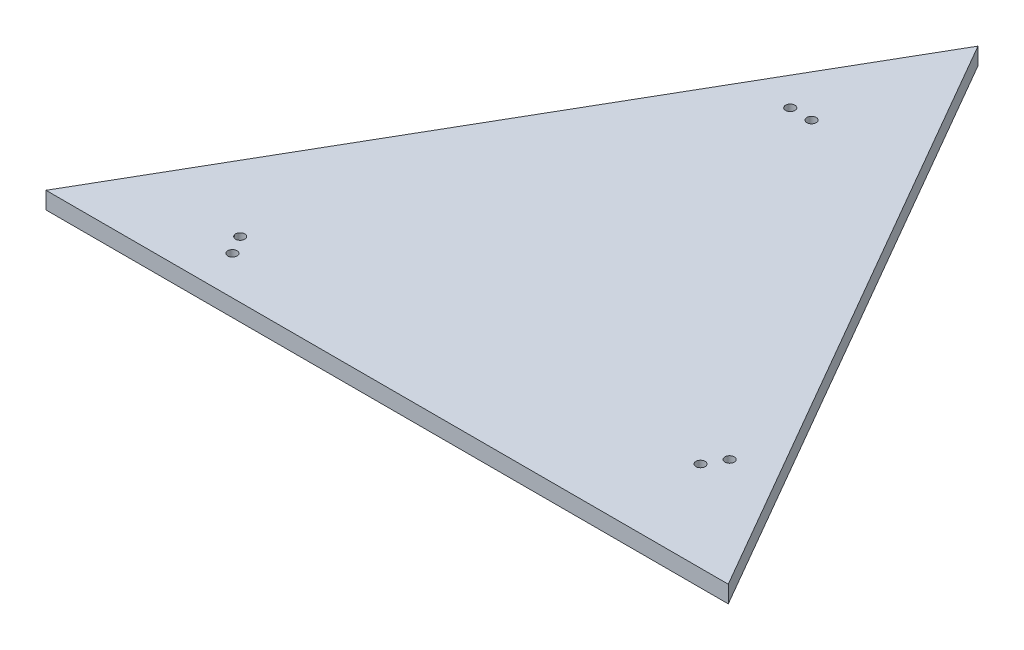
ISO-10303-21;
HEADER;
FILE_DESCRIPTION(('STEP AP214'),'2;1');
FILE_NAME('part.step','',(''),(''),'','','');
FILE_SCHEMA(('AUTOMOTIVE_DESIGN { 1 0 10303 214 1 1 1 1 }'));
ENDSEC;
DATA;
#1=APPLICATION_CONTEXT('core data for automotive mechanical design processes');
#2=APPLICATION_PROTOCOL_DEFINITION('international standard','automotive_design',2000,#1);
#3=PRODUCT_CONTEXT('',#1,'mechanical');
#4=PRODUCT('Part','Part','',(#3));
#5=PRODUCT_RELATED_PRODUCT_CATEGORY('part','',(#4));
#6=PRODUCT_DEFINITION_FORMATION('','',#4);
#7=PRODUCT_DEFINITION_CONTEXT('part definition',#1,'design');
#8=PRODUCT_DEFINITION('design','',#6,#7);
#9=PRODUCT_DEFINITION_SHAPE('','',#8);
#10=(LENGTH_UNIT() NAMED_UNIT(*) SI_UNIT(.MILLI.,.METRE.));
#11=(NAMED_UNIT(*) PLANE_ANGLE_UNIT() SI_UNIT($,.RADIAN.));
#12=(NAMED_UNIT(*) SI_UNIT($,.STERADIAN.) SOLID_ANGLE_UNIT());
#13=UNCERTAINTY_MEASURE_WITH_UNIT(LENGTH_MEASURE(1.E-05),#10,'distance_accuracy_value','');
#14=(GEOMETRIC_REPRESENTATION_CONTEXT(3) GLOBAL_UNCERTAINTY_ASSIGNED_CONTEXT((#13)) GLOBAL_UNIT_ASSIGNED_CONTEXT((#10,
#11,#12)) REPRESENTATION_CONTEXT('',''));
#15=CARTESIAN_POINT('',(0.,0.,0.));
#16=DIRECTION('',(0.,0.,1.));
#17=DIRECTION('',(1.,0.,0.));
#18=AXIS2_PLACEMENT_3D('',#15,#16,#17);
#19=CARTESIAN_POINT('',(127.,6.35,73.3234841870812));
#20=DIRECTION('',(-0.866025403784437,0.,0.500000000000002));
#21=DIRECTION('',(0.500000000000002,0.,0.866025403784437));
#22=AXIS2_PLACEMENT_3D('',#19,#20,#21);
#23=PLANE('',#22);
#24=DIRECTION('',(-0.500000000000002,0.,-0.866025403784437));
#25=VECTOR('',#24,1.);
#26=CARTESIAN_POINT('',(127.,0.,73.3234841870812));
#27=LINE('',#26,#25);
#28=CARTESIAN_POINT('',(127.,0.,73.3234841870812));
#29=VERTEX_POINT('',#28);
#30=CARTESIAN_POINT('',(0.,0.,-146.646968374165));
#31=VERTEX_POINT('',#30);
#32=EDGE_CURVE('E79',#29,#31,#27,.T.);
#33=ORIENTED_EDGE('',*,*,#32,.T.);
#34=DIRECTION('',(0.,-1.,0.));
#35=VECTOR('',#34,1.);
#36=CARTESIAN_POINT('',(0.,6.35,-146.646968374165));
#37=LINE('',#36,#35);
#38=CARTESIAN_POINT('',(0.,6.35,-146.646968374165));
#39=VERTEX_POINT('',#38);
#40=EDGE_CURVE('E11',#39,#31,#37,.T.);
#41=ORIENTED_EDGE('',*,*,#40,.F.);
#42=DIRECTION('',(-0.500000000000002,0.,-0.866025403784437));
#43=VECTOR('',#42,1.);
#44=CARTESIAN_POINT('',(127.,6.35,73.3234841870812));
#45=LINE('',#44,#43);
#46=CARTESIAN_POINT('',(127.,6.35,73.3234841870812));
#47=VERTEX_POINT('',#46);
#48=EDGE_CURVE('E72',#47,#39,#45,.T.);
#49=ORIENTED_EDGE('',*,*,#48,.F.);
#50=DIRECTION('',(0.,-1.,0.));
#51=VECTOR('',#50,1.);
#52=CARTESIAN_POINT('',(127.,6.35,73.3234841870812));
#53=LINE('',#52,#51);
#54=EDGE_CURVE('E80',#47,#29,#53,.T.);
#55=ORIENTED_EDGE('',*,*,#54,.T.);
#56=EDGE_LOOP('',(#33,#41,#49,#55));
#57=FACE_BOUND('',#56,.T.);
#58=ADVANCED_FACE('F32',(#57),#23,.F.);
#59=CARTESIAN_POINT('',(0.,6.35,-146.646968374165));
#60=DIRECTION('',(0.86602540378444,0.,0.499999999999998));
#61=DIRECTION('',(0.499999999999998,0.,-0.86602540378444));
#62=AXIS2_PLACEMENT_3D('',#59,#60,#61);
#63=PLANE('',#62);
#64=DIRECTION('',(-0.499999999999998,0.,0.86602540378444));
#65=VECTOR('',#64,1.);
#66=CARTESIAN_POINT('',(0.,0.,-146.646968374165));
#67=LINE('',#66,#65);
#68=CARTESIAN_POINT('',(-126.999999999999,0.,73.323484187083));
#69=VERTEX_POINT('',#68);
#70=EDGE_CURVE('E60',#31,#69,#67,.T.);
#71=ORIENTED_EDGE('',*,*,#70,.T.);
#72=DIRECTION('',(0.,-1.,0.));
#73=VECTOR('',#72,1.);
#74=CARTESIAN_POINT('',(-126.999999999999,6.35,73.323484187083));
#75=LINE('',#74,#73);
#76=CARTESIAN_POINT('',(-126.999999999999,6.35,73.323484187083));
#77=VERTEX_POINT('',#76);
#78=EDGE_CURVE('E40',#77,#69,#75,.T.);
#79=ORIENTED_EDGE('',*,*,#78,.F.);
#80=DIRECTION('',(-0.499999999999998,0.,0.86602540378444));
#81=VECTOR('',#80,1.);
#82=CARTESIAN_POINT('',(0.,6.35,-146.646968374165));
#83=LINE('',#82,#81);
#84=EDGE_CURVE('E68',#39,#77,#83,.T.);
#85=ORIENTED_EDGE('',*,*,#84,.F.);
#86=ORIENTED_EDGE('',*,*,#40,.T.);
#87=EDGE_LOOP('',(#71,#79,#85,#86));
#88=FACE_BOUND('',#87,.T.);
#89=ADVANCED_FACE('F69',(#88),#63,.F.);
#90=CARTESIAN_POINT('',(-126.999999999999,6.35,73.323484187083));
#91=DIRECTION('',(0.,0.,-1.));
#92=DIRECTION('',(-1.,0.,0.));
#93=AXIS2_PLACEMENT_3D('',#90,#91,#92);
#94=PLANE('',#93);
#95=DIRECTION('',(1.,0.,0.));
#96=VECTOR('',#95,1.);
#97=CARTESIAN_POINT('',(-126.999999999999,0.,73.323484187083));
#98=LINE('',#97,#96);
#99=EDGE_CURVE('E65',#69,#29,#98,.T.);
#100=ORIENTED_EDGE('',*,*,#99,.T.);
#101=ORIENTED_EDGE('',*,*,#54,.F.);
#102=DIRECTION('',(1.,0.,0.));
#103=VECTOR('',#102,1.);
#104=CARTESIAN_POINT('',(-126.999999999999,6.35,73.323484187083));
#105=LINE('',#104,#103);
#106=EDGE_CURVE('E48',#77,#47,#105,.T.);
#107=ORIENTED_EDGE('',*,*,#106,.F.);
#108=ORIENTED_EDGE('',*,*,#78,.T.);
#109=EDGE_LOOP('',(#100,#101,#107,#108));
#110=FACE_BOUND('',#109,.T.);
#111=ADVANCED_FACE('F91',(#110),#94,.F.);
#112=CARTESIAN_POINT('',(0.,6.35,0.));
#113=DIRECTION('',(0.,1.,0.));
#114=DIRECTION('',(0.,0.,1.));
#115=AXIS2_PLACEMENT_3D('',#112,#113,#114);
#116=PLANE('',#115);
#117=CARTESIAN_POINT('',(87.0425218066059,6.35,32.8616929468107));
#118=DIRECTION('',(0.,1.,0.));
#119=DIRECTION('',(0.,0.,1.));
#120=AXIS2_PLACEMENT_3D('',#117,#118,#119);
#121=CIRCLE('',#120,1.72720000000002);
#122=CARTESIAN_POINT('',(87.0425218066059,6.35,34.5888929468107));
#123=VERTEX_POINT('',#122);
#124=EDGE_CURVE('E190',#123,#123,#121,.T.);
#125=ORIENTED_EDGE('',*,*,#124,.F.);
#126=EDGE_LOOP('',(#125));
#127=FACE_BOUND('',#126,.T.);
#128=CARTESIAN_POINT('',(-7.1374,6.35,-91.8118815673871));
#129=DIRECTION('',(0.,1.,0.));
#130=DIRECTION('',(0.,0.,1.));
#131=AXIS2_PLACEMENT_3D('',#128,#129,#130);
#132=CIRCLE('',#131,1.7272);
#133=CARTESIAN_POINT('',(-7.1374,6.35,-90.0846815673871));
#134=VERTEX_POINT('',#133);
#135=EDGE_CURVE('E194',#134,#134,#132,.T.);
#136=ORIENTED_EDGE('',*,*,#135,.F.);
#137=EDGE_LOOP('',(#136));
#138=FACE_BOUND('',#137,.T.);
#139=CARTESIAN_POINT('',(-15.0622,6.35,-91.8118815673871));
#140=DIRECTION('',(0.,1.,0.));
#141=DIRECTION('',(0.,0.,1.));
#142=AXIS2_PLACEMENT_3D('',#139,#140,#141);
#143=CIRCLE('',#142,1.7272);
#144=CARTESIAN_POINT('',(-15.0622,6.35,-90.0846815673871));
#145=VERTEX_POINT('',#144);
#146=EDGE_CURVE('E201',#145,#145,#143,.T.);
#147=ORIENTED_EDGE('',*,*,#146,.F.);
#148=EDGE_LOOP('',(#147));
#149=FACE_BOUND('',#148,.T.);
#150=CARTESIAN_POINT('',(83.0801218066059,6.35,39.7247710667216));
#151=DIRECTION('',(0.,1.,0.));
#152=DIRECTION('',(0.,0.,1.));
#153=AXIS2_PLACEMENT_3D('',#150,#151,#152);
#154=CIRCLE('',#153,1.72720000000002);
#155=CARTESIAN_POINT('',(83.0801218066059,6.35,41.4519710667216));
#156=VERTEX_POINT('',#155);
#157=EDGE_CURVE('E207',#156,#156,#154,.T.);
#158=ORIENTED_EDGE('',*,*,#157,.F.);
#159=EDGE_LOOP('',(#158));
#160=FACE_BOUND('',#159,.T.);
#161=CARTESIAN_POINT('',(-71.9803218066055,6.35,58.9501886205757));
#162=DIRECTION('',(0.,1.,0.));
#163=DIRECTION('',(0.,0.,1.));
#164=AXIS2_PLACEMENT_3D('',#161,#162,#163);
#165=CIRCLE('',#164,1.72720000000002);
#166=CARTESIAN_POINT('',(-71.9803218066055,6.35,60.6773886205757));
#167=VERTEX_POINT('',#166);
#168=EDGE_CURVE('E213',#167,#167,#165,.T.);
#169=ORIENTED_EDGE('',*,*,#168,.F.);
#170=EDGE_LOOP('',(#169));
#171=FACE_BOUND('',#170,.T.);
#172=CARTESIAN_POINT('',(-75.9427218066056,6.35,52.0871105006648));
#173=DIRECTION('',(0.,1.,0.));
#174=DIRECTION('',(0.,0.,1.));
#175=AXIS2_PLACEMENT_3D('',#172,#173,#174);
#176=CIRCLE('',#175,1.72720000000001);
#177=CARTESIAN_POINT('',(-75.9427218066056,6.35,53.8143105006648));
#178=VERTEX_POINT('',#177);
#179=EDGE_CURVE('E86',#178,#178,#176,.T.);
#180=ORIENTED_EDGE('',*,*,#179,.F.);
#181=EDGE_LOOP('',(#180));
#182=FACE_BOUND('',#181,.T.);
#183=ORIENTED_EDGE('',*,*,#48,.T.);
#184=ORIENTED_EDGE('',*,*,#84,.T.);
#185=ORIENTED_EDGE('',*,*,#106,.T.);
#186=EDGE_LOOP('',(#183,#184,#185));
#187=FACE_BOUND('',#186,.T.);
#188=ADVANCED_FACE('F75',(#127,#138,#149,#160,#171,#182,#187),#116,.T.);
#189=CARTESIAN_POINT('',(0.,0.,0.));
#190=DIRECTION('',(0.,1.,0.));
#191=DIRECTION('',(0.,0.,1.));
#192=AXIS2_PLACEMENT_3D('',#189,#190,#191);
#193=PLANE('',#192);
#194=CARTESIAN_POINT('',(87.0425218066059,0.,32.8616929468107));
#195=DIRECTION('',(0.,1.,0.));
#196=DIRECTION('',(0.,0.,1.));
#197=AXIS2_PLACEMENT_3D('',#194,#195,#196);
#198=CIRCLE('',#197,1.72720000000002);
#199=CARTESIAN_POINT('',(87.0425218066059,0.,34.5888929468107));
#200=VERTEX_POINT('',#199);
#201=EDGE_CURVE('E187',#200,#200,#198,.T.);
#202=ORIENTED_EDGE('',*,*,#201,.T.);
#203=EDGE_LOOP('',(#202));
#204=FACE_BOUND('',#203,.T.);
#205=CARTESIAN_POINT('',(-7.1374,0.,-91.8118815673871));
#206=DIRECTION('',(0.,1.,0.));
#207=DIRECTION('',(0.,0.,1.));
#208=AXIS2_PLACEMENT_3D('',#205,#206,#207);
#209=CIRCLE('',#208,1.7272);
#210=CARTESIAN_POINT('',(-7.1374,0.,-90.0846815673871));
#211=VERTEX_POINT('',#210);
#212=EDGE_CURVE('E191',#211,#211,#209,.T.);
#213=ORIENTED_EDGE('',*,*,#212,.T.);
#214=EDGE_LOOP('',(#213));
#215=FACE_BOUND('',#214,.T.);
#216=CARTESIAN_POINT('',(-15.0622,0.,-91.8118815673871));
#217=DIRECTION('',(0.,1.,0.));
#218=DIRECTION('',(0.,0.,1.));
#219=AXIS2_PLACEMENT_3D('',#216,#217,#218);
#220=CIRCLE('',#219,1.7272);
#221=CARTESIAN_POINT('',(-15.0622,0.,-90.0846815673871));
#222=VERTEX_POINT('',#221);
#223=EDGE_CURVE('E199',#222,#222,#220,.T.);
#224=ORIENTED_EDGE('',*,*,#223,.T.);
#225=EDGE_LOOP('',(#224));
#226=FACE_BOUND('',#225,.T.);
#227=CARTESIAN_POINT('',(83.0801218066059,0.,39.7247710667216));
#228=DIRECTION('',(0.,1.,0.));
#229=DIRECTION('',(0.,0.,1.));
#230=AXIS2_PLACEMENT_3D('',#227,#228,#229);
#231=CIRCLE('',#230,1.72720000000002);
#232=CARTESIAN_POINT('',(83.0801218066059,0.,41.4519710667216));
#233=VERTEX_POINT('',#232);
#234=EDGE_CURVE('E204',#233,#233,#231,.T.);
#235=ORIENTED_EDGE('',*,*,#234,.T.);
#236=EDGE_LOOP('',(#235));
#237=FACE_BOUND('',#236,.T.);
#238=CARTESIAN_POINT('',(-71.9803218066055,0.,58.9501886205757));
#239=DIRECTION('',(0.,1.,0.));
#240=DIRECTION('',(0.,0.,1.));
#241=AXIS2_PLACEMENT_3D('',#238,#239,#240);
#242=CIRCLE('',#241,1.72720000000002);
#243=CARTESIAN_POINT('',(-71.9803218066055,0.,60.6773886205757));
#244=VERTEX_POINT('',#243);
#245=EDGE_CURVE('E210',#244,#244,#242,.T.);
#246=ORIENTED_EDGE('',*,*,#245,.T.);
#247=EDGE_LOOP('',(#246));
#248=FACE_BOUND('',#247,.T.);
#249=CARTESIAN_POINT('',(-75.9427218066056,0.,52.0871105006648));
#250=DIRECTION('',(0.,1.,0.));
#251=DIRECTION('',(0.,0.,1.));
#252=AXIS2_PLACEMENT_3D('',#249,#250,#251);
#253=CIRCLE('',#252,1.72720000000001);
#254=CARTESIAN_POINT('',(-75.9427218066056,0.,53.8143105006648));
#255=VERTEX_POINT('',#254);
#256=EDGE_CURVE('E82',#255,#255,#253,.T.);
#257=ORIENTED_EDGE('',*,*,#256,.T.);
#258=EDGE_LOOP('',(#257));
#259=FACE_BOUND('',#258,.T.);
#260=ORIENTED_EDGE('',*,*,#32,.F.);
#261=ORIENTED_EDGE('',*,*,#99,.F.);
#262=ORIENTED_EDGE('',*,*,#70,.F.);
#263=EDGE_LOOP('',(#260,#261,#262));
#264=FACE_BOUND('',#263,.T.);
#265=ADVANCED_FACE('F92',(#204,#215,#226,#237,#248,#259,#264),#193,.F.);
#266=CARTESIAN_POINT('',(-75.9427218066056,0.,52.0871105006648));
#267=DIRECTION('',(0.,1.,0.));
#268=DIRECTION('',(0.,0.,1.));
#269=AXIS2_PLACEMENT_3D('',#266,#267,#268);
#270=CYLINDRICAL_SURFACE('',#269,1.72720000000001);
#271=ORIENTED_EDGE('',*,*,#256,.F.);
#272=EDGE_LOOP('',(#271));
#273=FACE_BOUND('',#272,.T.);
#274=ORIENTED_EDGE('',*,*,#179,.T.);
#275=EDGE_LOOP('',(#274));
#276=FACE_BOUND('',#275,.T.);
#277=ADVANCED_FACE('F94',(#273,#276),#270,.F.);
#278=CARTESIAN_POINT('',(-71.9803218066055,0.,58.9501886205757));
#279=DIRECTION('',(0.,1.,0.));
#280=DIRECTION('',(0.,0.,1.));
#281=AXIS2_PLACEMENT_3D('',#278,#279,#280);
#282=CYLINDRICAL_SURFACE('',#281,1.72720000000002);
#283=ORIENTED_EDGE('',*,*,#245,.F.);
#284=EDGE_LOOP('',(#283));
#285=FACE_BOUND('',#284,.T.);
#286=ORIENTED_EDGE('',*,*,#168,.T.);
#287=EDGE_LOOP('',(#286));
#288=FACE_BOUND('',#287,.T.);
#289=ADVANCED_FACE('F101',(#285,#288),#282,.F.);
#290=CARTESIAN_POINT('',(83.0801218066059,0.,39.7247710667216));
#291=DIRECTION('',(0.,1.,0.));
#292=DIRECTION('',(0.,0.,1.));
#293=AXIS2_PLACEMENT_3D('',#290,#291,#292);
#294=CYLINDRICAL_SURFACE('',#293,1.72720000000002);
#295=ORIENTED_EDGE('',*,*,#234,.F.);
#296=EDGE_LOOP('',(#295));
#297=FACE_BOUND('',#296,.T.);
#298=ORIENTED_EDGE('',*,*,#157,.T.);
#299=EDGE_LOOP('',(#298));
#300=FACE_BOUND('',#299,.T.);
#301=ADVANCED_FACE('F141',(#297,#300),#294,.F.);
#302=CARTESIAN_POINT('',(-15.0622,0.,-91.8118815673871));
#303=DIRECTION('',(0.,1.,0.));
#304=DIRECTION('',(0.,0.,1.));
#305=AXIS2_PLACEMENT_3D('',#302,#303,#304);
#306=CYLINDRICAL_SURFACE('',#305,1.7272);
#307=ORIENTED_EDGE('',*,*,#223,.F.);
#308=EDGE_LOOP('',(#307));
#309=FACE_BOUND('',#308,.T.);
#310=ORIENTED_EDGE('',*,*,#146,.T.);
#311=EDGE_LOOP('',(#310));
#312=FACE_BOUND('',#311,.T.);
#313=ADVANCED_FACE('F151',(#309,#312),#306,.F.);
#314=CARTESIAN_POINT('',(-7.1374,0.,-91.8118815673871));
#315=DIRECTION('',(0.,1.,0.));
#316=DIRECTION('',(0.,0.,1.));
#317=AXIS2_PLACEMENT_3D('',#314,#315,#316);
#318=CYLINDRICAL_SURFACE('',#317,1.7272);
#319=ORIENTED_EDGE('',*,*,#212,.F.);
#320=EDGE_LOOP('',(#319));
#321=FACE_BOUND('',#320,.T.);
#322=ORIENTED_EDGE('',*,*,#135,.T.);
#323=EDGE_LOOP('',(#322));
#324=FACE_BOUND('',#323,.T.);
#325=ADVANCED_FACE('F161',(#321,#324),#318,.F.);
#326=CARTESIAN_POINT('',(87.0425218066059,0.,32.8616929468107));
#327=DIRECTION('',(0.,1.,0.));
#328=DIRECTION('',(0.,0.,1.));
#329=AXIS2_PLACEMENT_3D('',#326,#327,#328);
#330=CYLINDRICAL_SURFACE('',#329,1.72720000000002);
#331=ORIENTED_EDGE('',*,*,#201,.F.);
#332=EDGE_LOOP('',(#331));
#333=FACE_BOUND('',#332,.T.);
#334=ORIENTED_EDGE('',*,*,#124,.T.);
#335=EDGE_LOOP('',(#334));
#336=FACE_BOUND('',#335,.T.);
#337=ADVANCED_FACE('F171',(#333,#336),#330,.F.);
#338=CLOSED_SHELL('',(#58,#89,#111,#188,#265,#277,#289,#301,#313,#325,#337));
#339=MANIFOLD_SOLID_BREP('B2',#338);
#340=ADVANCED_BREP_SHAPE_REPRESENTATION('',(#18,#339),#14);
#341=SHAPE_DEFINITION_REPRESENTATION(#9,#340);
ENDSEC;
END-ISO-10303-21;
